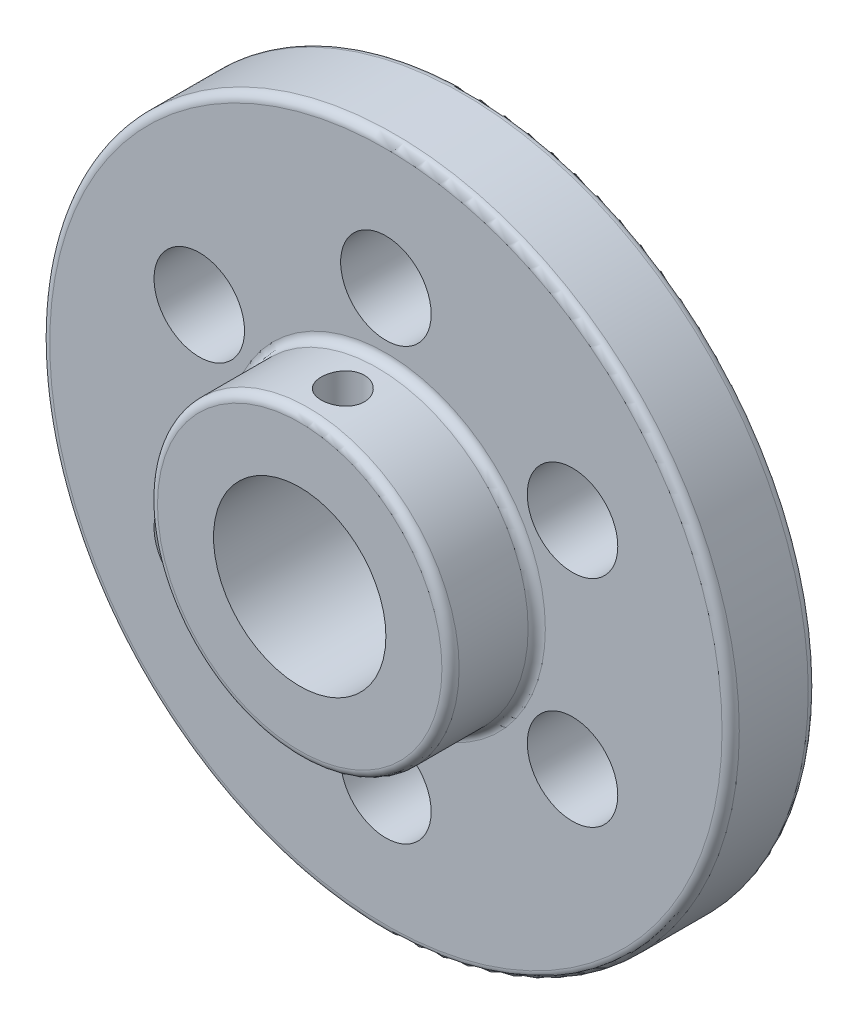
ISO-10303-21;
HEADER;
FILE_DESCRIPTION(('STEP AP214'),'2;1');
FILE_NAME('part.step','',(''),(''),'','','');
FILE_SCHEMA(('AUTOMOTIVE_DESIGN { 1 0 10303 214 1 1 1 1 }'));
ENDSEC;
DATA;
#1=APPLICATION_CONTEXT('core data for automotive mechanical design processes');
#2=APPLICATION_PROTOCOL_DEFINITION('international standard','automotive_design',2000,#1);
#3=PRODUCT_CONTEXT('',#1,'mechanical');
#4=PRODUCT('Part','Part','',(#3));
#5=PRODUCT_RELATED_PRODUCT_CATEGORY('part','',(#4));
#6=PRODUCT_DEFINITION_FORMATION('','',#4);
#7=PRODUCT_DEFINITION_CONTEXT('part definition',#1,'design');
#8=PRODUCT_DEFINITION('design','',#6,#7);
#9=PRODUCT_DEFINITION_SHAPE('','',#8);
#10=(LENGTH_UNIT() NAMED_UNIT(*) SI_UNIT(.MILLI.,.METRE.));
#11=(NAMED_UNIT(*) PLANE_ANGLE_UNIT() SI_UNIT($,.RADIAN.));
#12=(NAMED_UNIT(*) SI_UNIT($,.STERADIAN.) SOLID_ANGLE_UNIT());
#13=UNCERTAINTY_MEASURE_WITH_UNIT(LENGTH_MEASURE(1.E-05),#10,'distance_accuracy_value','');
#14=(GEOMETRIC_REPRESENTATION_CONTEXT(3) GLOBAL_UNCERTAINTY_ASSIGNED_CONTEXT((#13)) GLOBAL_UNIT_ASSIGNED_CONTEXT((#10,
#11,#12)) REPRESENTATION_CONTEXT('',''));
#15=CARTESIAN_POINT('',(0.,0.,0.));
#16=DIRECTION('',(0.,0.,1.));
#17=DIRECTION('',(1.,0.,0.));
#18=AXIS2_PLACEMENT_3D('',#15,#16,#17);
#19=CARTESIAN_POINT('',(0.,0.,10.));
#20=DIRECTION('',(0.,0.,1.));
#21=DIRECTION('',(1.,0.,0.));
#22=AXIS2_PLACEMENT_3D('',#19,#20,#21);
#23=PLANE('',#22);
#24=CARTESIAN_POINT('',(0.,0.,10.));
#25=DIRECTION('',(0.,0.,1.));
#26=DIRECTION('',(1.,0.,0.));
#27=AXIS2_PLACEMENT_3D('',#24,#25,#26);
#28=CIRCLE('',#27,18.5);
#29=CARTESIAN_POINT('',(18.5,0.,10.));
#30=VERTEX_POINT('',#29);
#31=EDGE_CURVE('E56',#30,#30,#28,.F.);
#32=ORIENTED_EDGE('',*,*,#31,.T.);
#33=EDGE_LOOP('',(#32));
#34=FACE_BOUND('',#33,.T.);
#35=CARTESIAN_POINT('',(0.,0.,10.));
#36=DIRECTION('',(0.,0.,1.));
#37=DIRECTION('',(1.,0.,0.));
#38=AXIS2_PLACEMENT_3D('',#35,#36,#37);
#39=CIRCLE('',#38,39.);
#40=CARTESIAN_POINT('',(39.,0.,10.));
#41=VERTEX_POINT('',#40);
#42=EDGE_CURVE('E61',#41,#41,#39,.T.);
#43=ORIENTED_EDGE('',*,*,#42,.T.);
#44=EDGE_LOOP('',(#43));
#45=FACE_BOUND('',#44,.T.);
#46=CARTESIAN_POINT('',(21.6506350946108,12.5000000000003,10.));
#47=DIRECTION('',(0.,0.,1.));
#48=DIRECTION('',(1.,0.,0.));
#49=AXIS2_PLACEMENT_3D('',#46,#47,#48);
#50=CIRCLE('',#49,5.24999999999999);
#51=CARTESIAN_POINT('',(26.9006350946108,12.5000000000003,10.));
#52=VERTEX_POINT('',#51);
#53=EDGE_CURVE('E109',#52,#52,#50,.T.);
#54=ORIENTED_EDGE('',*,*,#53,.F.);
#55=EDGE_LOOP('',(#54));
#56=FACE_BOUND('',#55,.T.);
#57=CARTESIAN_POINT('',(21.6506350946111,-12.4999999999998,10.));
#58=DIRECTION('',(0.,0.,1.));
#59=DIRECTION('',(1.,0.,0.));
#60=AXIS2_PLACEMENT_3D('',#57,#58,#59);
#61=CIRCLE('',#60,5.24999999999999);
#62=CARTESIAN_POINT('',(26.9006350946111,-12.4999999999998,10.));
#63=VERTEX_POINT('',#62);
#64=EDGE_CURVE('E103',#63,#63,#61,.T.);
#65=ORIENTED_EDGE('',*,*,#64,.F.);
#66=EDGE_LOOP('',(#65));
#67=FACE_BOUND('',#66,.T.);
#68=CARTESIAN_POINT('',(0.,-25.,10.));
#69=DIRECTION('',(0.,0.,1.));
#70=DIRECTION('',(1.,0.,0.));
#71=AXIS2_PLACEMENT_3D('',#68,#69,#70);
#72=CIRCLE('',#71,5.24999999999999);
#73=CARTESIAN_POINT('',(5.24999999999999,-25.,10.));
#74=VERTEX_POINT('',#73);
#75=EDGE_CURVE('E97',#74,#74,#72,.T.);
#76=ORIENTED_EDGE('',*,*,#75,.F.);
#77=EDGE_LOOP('',(#76));
#78=FACE_BOUND('',#77,.T.);
#79=CARTESIAN_POINT('',(-21.6506350946109,-12.5000000000001,10.));
#80=DIRECTION('',(0.,0.,1.));
#81=DIRECTION('',(1.,0.,0.));
#82=AXIS2_PLACEMENT_3D('',#79,#80,#81);
#83=CIRCLE('',#82,5.24999999999999);
#84=CARTESIAN_POINT('',(-16.4006350946109,-12.5000000000001,10.));
#85=VERTEX_POINT('',#84);
#86=EDGE_CURVE('E91',#85,#85,#83,.T.);
#87=ORIENTED_EDGE('',*,*,#86,.F.);
#88=EDGE_LOOP('',(#87));
#89=FACE_BOUND('',#88,.T.);
#90=CARTESIAN_POINT('',(-21.650635094611,12.5,10.));
#91=DIRECTION('',(0.,0.,1.));
#92=DIRECTION('',(1.,0.,0.));
#93=AXIS2_PLACEMENT_3D('',#90,#91,#92);
#94=CIRCLE('',#93,5.24999999999999);
#95=CARTESIAN_POINT('',(-16.400635094611,12.5,10.));
#96=VERTEX_POINT('',#95);
#97=EDGE_CURVE('E85',#96,#96,#94,.T.);
#98=ORIENTED_EDGE('',*,*,#97,.F.);
#99=EDGE_LOOP('',(#98));
#100=FACE_BOUND('',#99,.T.);
#101=CARTESIAN_POINT('',(0.,25.,10.));
#102=DIRECTION('',(0.,0.,1.));
#103=DIRECTION('',(1.,0.,0.));
#104=AXIS2_PLACEMENT_3D('',#101,#102,#103);
#105=CIRCLE('',#104,5.24999999999999);
#106=CARTESIAN_POINT('',(5.24999999999999,25.,10.));
#107=VERTEX_POINT('',#106);
#108=EDGE_CURVE('E79',#107,#107,#105,.T.);
#109=ORIENTED_EDGE('',*,*,#108,.F.);
#110=EDGE_LOOP('',(#109));
#111=FACE_BOUND('',#110,.T.);
#112=ADVANCED_FACE('F41',(#34,#45,#56,#67,#78,#89,#100,#111),#23,.T.);
#113=CARTESIAN_POINT('',(0.,0.,0.));
#114=DIRECTION('',(0.,0.,1.));
#115=DIRECTION('',(1.,0.,0.));
#116=AXIS2_PLACEMENT_3D('',#113,#114,#115);
#117=PLANE('',#116);
#118=CARTESIAN_POINT('',(0.,0.,0.));
#119=DIRECTION('',(0.,0.,1.));
#120=DIRECTION('',(1.,0.,0.));
#121=AXIS2_PLACEMENT_3D('',#118,#119,#120);
#122=CIRCLE('',#121,39.);
#123=CARTESIAN_POINT('',(39.,0.,0.));
#124=VERTEX_POINT('',#123);
#125=EDGE_CURVE('E10',#124,#124,#122,.F.);
#126=ORIENTED_EDGE('',*,*,#125,.T.);
#127=EDGE_LOOP('',(#126));
#128=FACE_BOUND('',#127,.T.);
#129=CARTESIAN_POINT('',(21.6506350946108,12.5000000000003,0.));
#130=DIRECTION('',(0.,0.,1.));
#131=DIRECTION('',(1.,0.,0.));
#132=AXIS2_PLACEMENT_3D('',#129,#130,#131);
#133=CIRCLE('',#132,5.25);
#134=CARTESIAN_POINT('',(26.9006350946108,12.5000000000003,0.));
#135=VERTEX_POINT('',#134);
#136=EDGE_CURVE('E106',#135,#135,#133,.T.);
#137=ORIENTED_EDGE('',*,*,#136,.T.);
#138=EDGE_LOOP('',(#137));
#139=FACE_BOUND('',#138,.T.);
#140=CARTESIAN_POINT('',(21.6506350946111,-12.4999999999998,0.));
#141=DIRECTION('',(0.,0.,1.));
#142=DIRECTION('',(1.,0.,0.));
#143=AXIS2_PLACEMENT_3D('',#140,#141,#142);
#144=CIRCLE('',#143,5.25);
#145=CARTESIAN_POINT('',(26.9006350946111,-12.4999999999998,0.));
#146=VERTEX_POINT('',#145);
#147=EDGE_CURVE('E100',#146,#146,#144,.T.);
#148=ORIENTED_EDGE('',*,*,#147,.T.);
#149=EDGE_LOOP('',(#148));
#150=FACE_BOUND('',#149,.T.);
#151=CARTESIAN_POINT('',(0.,-25.,0.));
#152=DIRECTION('',(0.,0.,1.));
#153=DIRECTION('',(1.,0.,0.));
#154=AXIS2_PLACEMENT_3D('',#151,#152,#153);
#155=CIRCLE('',#154,5.25);
#156=CARTESIAN_POINT('',(5.25,-25.,0.));
#157=VERTEX_POINT('',#156);
#158=EDGE_CURVE('E94',#157,#157,#155,.T.);
#159=ORIENTED_EDGE('',*,*,#158,.T.);
#160=EDGE_LOOP('',(#159));
#161=FACE_BOUND('',#160,.T.);
#162=CARTESIAN_POINT('',(-21.6506350946109,-12.5000000000001,0.));
#163=DIRECTION('',(0.,0.,1.));
#164=DIRECTION('',(1.,0.,0.));
#165=AXIS2_PLACEMENT_3D('',#162,#163,#164);
#166=CIRCLE('',#165,5.24999999999999);
#167=CARTESIAN_POINT('',(-16.4006350946109,-12.5000000000001,0.));
#168=VERTEX_POINT('',#167);
#169=EDGE_CURVE('E88',#168,#168,#166,.T.);
#170=ORIENTED_EDGE('',*,*,#169,.T.);
#171=EDGE_LOOP('',(#170));
#172=FACE_BOUND('',#171,.T.);
#173=CARTESIAN_POINT('',(-21.650635094611,12.5,0.));
#174=DIRECTION('',(0.,0.,1.));
#175=DIRECTION('',(1.,0.,0.));
#176=AXIS2_PLACEMENT_3D('',#173,#174,#175);
#177=CIRCLE('',#176,5.24999999999999);
#178=CARTESIAN_POINT('',(-16.400635094611,12.5,0.));
#179=VERTEX_POINT('',#178);
#180=EDGE_CURVE('E82',#179,#179,#177,.T.);
#181=ORIENTED_EDGE('',*,*,#180,.T.);
#182=EDGE_LOOP('',(#181));
#183=FACE_BOUND('',#182,.T.);
#184=CARTESIAN_POINT('',(0.,25.,0.));
#185=DIRECTION('',(0.,0.,1.));
#186=DIRECTION('',(1.,0.,0.));
#187=AXIS2_PLACEMENT_3D('',#184,#185,#186);
#188=CIRCLE('',#187,5.25);
#189=CARTESIAN_POINT('',(5.25,25.,0.));
#190=VERTEX_POINT('',#189);
#191=EDGE_CURVE('E76',#190,#190,#188,.T.);
#192=ORIENTED_EDGE('',*,*,#191,.T.);
#193=EDGE_LOOP('',(#192));
#194=FACE_BOUND('',#193,.T.);
#195=CARTESIAN_POINT('',(0.,0.,0.));
#196=DIRECTION('',(0.,0.,1.));
#197=DIRECTION('',(1.,0.,0.));
#198=AXIS2_PLACEMENT_3D('',#195,#196,#197);
#199=CIRCLE('',#198,10.);
#200=CARTESIAN_POINT('',(10.,0.,0.));
#201=VERTEX_POINT('',#200);
#202=EDGE_CURVE('E73',#201,#201,#199,.T.);
#203=ORIENTED_EDGE('',*,*,#202,.T.);
#204=EDGE_LOOP('',(#203));
#205=FACE_BOUND('',#204,.T.);
#206=ADVANCED_FACE('F153',(#128,#139,#150,#161,#172,#183,#194,#205),#117,.F.);
#207=CARTESIAN_POINT('',(0.,0.,10.));
#208=DIRECTION('',(0.,0.,-1.));
#209=DIRECTION('',(-1.,0.,0.));
#210=AXIS2_PLACEMENT_3D('',#207,#208,#209);
#211=CYLINDRICAL_SURFACE('',#210,40.);
#212=CARTESIAN_POINT('',(0.,0.,0.999999999999999));
#213=DIRECTION('',(0.,0.,1.));
#214=DIRECTION('',(1.,0.,0.));
#215=AXIS2_PLACEMENT_3D('',#212,#213,#214);
#216=CIRCLE('',#215,40.);
#217=CARTESIAN_POINT('',(40.,0.,0.999999999999999));
#218=VERTEX_POINT('',#217);
#219=EDGE_CURVE('E48',#218,#218,#216,.T.);
#220=ORIENTED_EDGE('',*,*,#219,.T.);
#221=EDGE_LOOP('',(#220));
#222=FACE_BOUND('',#221,.T.);
#223=CARTESIAN_POINT('',(0.,0.,9.));
#224=DIRECTION('',(0.,0.,1.));
#225=DIRECTION('',(1.,0.,0.));
#226=AXIS2_PLACEMENT_3D('',#223,#224,#225);
#227=CIRCLE('',#226,40.);
#228=CARTESIAN_POINT('',(40.,0.,9.));
#229=VERTEX_POINT('',#228);
#230=EDGE_CURVE('E52',#229,#229,#227,.F.);
#231=ORIENTED_EDGE('',*,*,#230,.T.);
#232=EDGE_LOOP('',(#231));
#233=FACE_BOUND('',#232,.T.);
#234=ADVANCED_FACE('F160',(#222,#233),#211,.T.);
#235=CARTESIAN_POINT('',(0.,0.,10.));
#236=DIRECTION('',(0.,0.,-1.));
#237=DIRECTION('',(-1.,0.,0.));
#238=AXIS2_PLACEMENT_3D('',#235,#236,#237);
#239=CYLINDRICAL_SURFACE('',#238,10.);
#240=CARTESIAN_POINT('',(0.,10.,17.5));
#241=CARTESIAN_POINT('',(-0.138126814449548,9.99999766446687,17.4999961237697));
#242=CARTESIAN_POINT('',(-0.276296929717934,9.99710963553044,17.4885140820437));
#243=CARTESIAN_POINT('',(-0.548677206284216,9.98586856383157,17.442958081155));
#244=CARTESIAN_POINT('',(-0.682885078117895,9.97751242366627,17.4088713174369));
#245=CARTESIAN_POINT('',(-0.94336812030429,9.9562604388672,17.3192679108965));
#246=CARTESIAN_POINT('',(-1.06965260571666,9.94337004736764,17.2637770021412));
#247=CARTESIAN_POINT('',(-1.31112021984071,9.91442239679369,17.1330310165919));
#248=CARTESIAN_POINT('',(-1.4263029739146,9.89836503090261,17.0577752731351));
#249=CARTESIAN_POINT('',(-1.64466987883485,9.86445689319489,16.8879986839097));
#250=CARTESIAN_POINT('',(-1.74759281676842,9.84657845246877,16.7931473750682));
#251=CARTESIAN_POINT('',(-1.93624821200553,9.81122700196561,16.5875796584849));
#252=CARTESIAN_POINT('',(-2.02197872824865,9.79375403816446,16.4768614617551));
#253=CARTESIAN_POINT('',(-2.17504423799828,9.76091292830281,16.240674622105));
#254=CARTESIAN_POINT('',(-2.24208702654189,9.74557990774685,16.1150112819854));
#255=CARTESIAN_POINT('',(-2.35399484758456,9.71915824696694,15.8537526472333));
#256=CARTESIAN_POINT('',(-2.39886342573356,9.70806892824031,15.7181589444466));
#257=CARTESIAN_POINT('',(-2.46425806134127,9.69167461160538,15.4437608363306));
#258=CARTESIAN_POINT('',(-2.48525378055341,9.68625818328352,15.30507517327));
#259=CARTESIAN_POINT('',(-2.50376962511067,9.68148937432653,15.0260523850011));
#260=CARTESIAN_POINT('',(-2.50129356969684,9.68213600713214,14.8857155321798));
#261=CARTESIAN_POINT('',(-2.4733108743995,9.68932009194695,14.6109736537577));
#262=CARTESIAN_POINT('',(-2.44836390031771,9.6957143834549,14.4765072975578));
#263=CARTESIAN_POINT('',(-2.37704031150498,9.71344516118448,14.2137315818149));
#264=CARTESIAN_POINT('',(-2.33066217011565,9.72478199948731,14.0854226616185));
#265=CARTESIAN_POINT('',(-2.21731579656197,9.75125189842765,13.8371033062465));
#266=CARTESIAN_POINT('',(-2.15014444538819,9.76642212449693,13.717189713684));
#267=CARTESIAN_POINT('',(-1.9972604600249,9.79882851409985,13.4901354837386));
#268=CARTESIAN_POINT('',(-1.91154458134805,9.81606503891047,13.3829970865546));
#269=CARTESIAN_POINT('',(-1.72110570780203,9.85126467566486,13.181327307176));
#270=CARTESIAN_POINT('',(-1.61591043027643,9.86923449130002,13.0872425165644));
#271=CARTESIAN_POINT('',(-1.39101986250616,9.90343275964594,12.9179645958935));
#272=CARTESIAN_POINT('',(-1.27132412951323,9.91966115915679,12.8427720428941));
#273=CARTESIAN_POINT('',(-1.02019314780231,9.94862886823651,12.7132490229594));
#274=CARTESIAN_POINT('',(-0.888718988681032,9.96135600212879,12.658991099576));
#275=CARTESIAN_POINT('',(-0.618126680238132,9.98179861652361,12.5734711571507));
#276=CARTESIAN_POINT('',(-0.479009998584135,9.98951505565468,12.5422047393031));
#277=CARTESIAN_POINT('',(-0.20089995065004,9.99892498785624,12.5042373907353));
#278=CARTESIAN_POINT('',(-0.0619945333136792,10.0007675584713,12.4969282898745));
#279=CARTESIAN_POINT('',(0.215054791335851,9.99864674690754,12.5054150034258));
#280=CARTESIAN_POINT('',(0.35319876607433,9.99468388736421,12.5212087379986));
#281=CARTESIAN_POINT('',(0.62269044796082,9.98149301878918,12.5749515139856));
#282=CARTESIAN_POINT('',(0.754108531614586,9.97234390309647,12.6125687724616));
#283=CARTESIAN_POINT('',(1.00876215408753,9.94981177723595,12.7085118067141));
#284=CARTESIAN_POINT('',(1.13199686505442,9.93642833949965,12.7668396738554));
#285=CARTESIAN_POINT('',(1.36920522404972,9.9065551321037,12.9037268814578));
#286=CARTESIAN_POINT('',(1.48297573639294,9.89001445610999,12.9826268539943));
#287=CARTESIAN_POINT('',(1.69587768940552,9.85574181979586,13.1579831813286));
#288=CARTESIAN_POINT('',(1.79500659828875,9.83800965421578,13.2544425660294));
#289=CARTESIAN_POINT('',(1.97831761345414,9.80281594932498,13.4650032680728));
#290=CARTESIAN_POINT('',(2.06207311270184,9.78537173637463,13.5794795049993));
#291=CARTESIAN_POINT('',(2.20918459835604,9.75321463970069,13.8212210574476));
#292=CARTESIAN_POINT('',(2.27254149026901,9.73850163474941,13.9484858049507));
#293=CARTESIAN_POINT('',(2.37658570101223,9.71363491194665,14.2115095373437));
#294=CARTESIAN_POINT('',(2.41740732773931,9.70345425375809,14.3472127138538));
#295=CARTESIAN_POINT('',(2.47557609990489,9.68877906706586,14.6238493964255));
#296=CARTESIAN_POINT('',(2.49292837912652,9.68428329504044,14.7647817517024));
#297=CARTESIAN_POINT('',(2.50339765056083,9.68158168701612,15.0435350397693));
#298=CARTESIAN_POINT('',(2.49719649630131,9.68319887888034,15.1813290585441));
#299=CARTESIAN_POINT('',(2.46229546385366,9.69213181672143,15.4538398144438));
#300=CARTESIAN_POINT('',(2.43359603781098,9.69944744817731,15.5885566133553));
#301=CARTESIAN_POINT('',(2.35488553240495,9.71885434473222,15.8503474317764));
#302=CARTESIAN_POINT('',(2.30500234113404,9.73091692061057,15.9774621754006));
#303=CARTESIAN_POINT('',(2.18544152267504,9.7584625954084,16.2216089711893));
#304=CARTESIAN_POINT('',(2.11576115005696,9.77394616867808,16.3386396219781));
#305=CARTESIAN_POINT('',(1.95644624772858,9.80709390439337,16.5625910483368));
#306=CARTESIAN_POINT('',(1.86633860485376,9.82480441386302,16.6691684557066));
#307=CARTESIAN_POINT('',(1.66964895198289,9.86013378743769,16.8659117413257));
#308=CARTESIAN_POINT('',(1.56306303543524,9.87775262878422,16.9560737168549));
#309=CARTESIAN_POINT('',(1.33411264450432,9.9112942607945,17.1190188476077));
#310=CARTESIAN_POINT('',(1.21149737052731,9.92718055609783,17.1914576894526));
#311=CARTESIAN_POINT('',(0.95544343251746,9.95508208291861,17.3145791049009));
#312=CARTESIAN_POINT('',(0.8220126057279,9.96710008666301,17.3652772677476));
#313=CARTESIAN_POINT('',(0.574017088739121,9.98413432609236,17.4359530505494));
#314=CARTESIAN_POINT('',(0.460633618180116,9.99004308421151,17.4599187384224));
#315=CARTESIAN_POINT('',(0.231510119227141,9.9979767538658,17.4919432393699));
#316=CARTESIAN_POINT('',(0.115770268737697,10.0000019575149,17.5000032488422));
#317=CARTESIAN_POINT('',(0.,10.,17.5));
#318=B_SPLINE_CURVE_WITH_KNOTS('',3,(#240,#241,#242,#243,#244,#245,#246,#247,#248,#249,#250,
#251,#252,#253,#254,#255,#256,#257,#258,#259,#260,#261,#262,#263,#264,#265,#266,#267,#268,#269,
#270,#271,#272,#273,#274,#275,#276,#277,#278,#279,#280,#281,#282,#283,#284,#285,#286,#287,#288,
#289,#290,#291,#292,#293,#294,#295,#296,#297,#298,#299,#300,#301,#302,#303,#304,#305,#306,#307,
#308,#309,#310,#311,#312,#313,#314,#315,#316,#317),.UNSPECIFIED.,.T.,.F.,(4,2,2,2,2,2,2,2,2,2,2,
2,2,2,2,2,2,2,2,2,2,2,2,2,2,2,2,2,2,2,2,2,2,2,2,2,2,2,4),(0.,0.413956187453149,
0.828147062939831,1.24184150381018,1.65554990028221,2.07690725728565,2.49831215966769,
2.92597745909678,3.3535743528228,3.77260491835116,4.19156730193362,4.6003749501723,
5.00921172448931,5.42217546461999,5.83521151399138,6.26002501620566,6.68485149269278,
7.11113715020723,7.53734122819938,7.95263848254327,8.36789835193437,8.77700457528928,
9.1861521220935,9.60255979281119,10.0190393835223,10.4457418201299,10.8724253125471,
11.2965375769763,11.7205570543047,12.1323963400748,12.5442273493652,12.9536066760887,
13.3630428023796,13.7831596069298,14.2033761629382,14.6312030917577,15.0587227304538,
15.4057040491338,15.7526592674819),.UNSPECIFIED.);
#319=CARTESIAN_POINT('',(0.,10.,17.5));
#320=VERTEX_POINT('',#319);
#321=EDGE_CURVE('E123',#320,#320,#318,.T.);
#322=ORIENTED_EDGE('',*,*,#321,.F.);
#323=EDGE_LOOP('',(#322));
#324=FACE_BOUND('',#323,.T.);
#325=ORIENTED_EDGE('',*,*,#202,.F.);
#326=EDGE_LOOP('',(#325));
#327=FACE_BOUND('',#326,.T.);
#328=CARTESIAN_POINT('',(0.,0.,20.));
#329=DIRECTION('',(0.,0.,1.));
#330=DIRECTION('',(1.,0.,0.));
#331=AXIS2_PLACEMENT_3D('',#328,#329,#330);
#332=CIRCLE('',#331,10.);
#333=CARTESIAN_POINT('',(10.,0.,20.));
#334=VERTEX_POINT('',#333);
#335=EDGE_CURVE('E112',#334,#334,#332,.T.);
#336=ORIENTED_EDGE('',*,*,#335,.T.);
#337=EDGE_LOOP('',(#336));
#338=FACE_BOUND('',#337,.T.);
#339=ADVANCED_FACE('F164',(#324,#327,#338),#239,.F.);
#340=CARTESIAN_POINT('',(0.,25.,10.));
#341=DIRECTION('',(0.,0.,1.));
#342=DIRECTION('',(1.,0.,0.));
#343=AXIS2_PLACEMENT_3D('',#340,#341,#342);
#344=CYLINDRICAL_SURFACE('',#343,5.24999999999999);
#345=ORIENTED_EDGE('',*,*,#191,.F.);
#346=EDGE_LOOP('',(#345));
#347=FACE_BOUND('',#346,.T.);
#348=ORIENTED_EDGE('',*,*,#108,.T.);
#349=EDGE_LOOP('',(#348));
#350=FACE_BOUND('',#349,.T.);
#351=ADVANCED_FACE('F200',(#347,#350),#344,.F.);
#352=CARTESIAN_POINT('',(-21.650635094611,12.5,10.));
#353=DIRECTION('',(0.,0.,1.));
#354=DIRECTION('',(1.,0.,0.));
#355=AXIS2_PLACEMENT_3D('',#352,#353,#354);
#356=CYLINDRICAL_SURFACE('',#355,5.24999999999999);
#357=ORIENTED_EDGE('',*,*,#180,.F.);
#358=EDGE_LOOP('',(#357));
#359=FACE_BOUND('',#358,.T.);
#360=ORIENTED_EDGE('',*,*,#97,.T.);
#361=EDGE_LOOP('',(#360));
#362=FACE_BOUND('',#361,.T.);
#363=ADVANCED_FACE('F202',(#359,#362),#356,.F.);
#364=CARTESIAN_POINT('',(-21.6506350946109,-12.5000000000001,10.));
#365=DIRECTION('',(0.,0.,1.));
#366=DIRECTION('',(1.,0.,0.));
#367=AXIS2_PLACEMENT_3D('',#364,#365,#366);
#368=CYLINDRICAL_SURFACE('',#367,5.24999999999999);
#369=ORIENTED_EDGE('',*,*,#169,.F.);
#370=EDGE_LOOP('',(#369));
#371=FACE_BOUND('',#370,.T.);
#372=ORIENTED_EDGE('',*,*,#86,.T.);
#373=EDGE_LOOP('',(#372));
#374=FACE_BOUND('',#373,.T.);
#375=ADVANCED_FACE('F208',(#371,#374),#368,.F.);
#376=CARTESIAN_POINT('',(0.,-25.,10.));
#377=DIRECTION('',(0.,0.,1.));
#378=DIRECTION('',(1.,0.,0.));
#379=AXIS2_PLACEMENT_3D('',#376,#377,#378);
#380=CYLINDRICAL_SURFACE('',#379,5.24999999999999);
#381=ORIENTED_EDGE('',*,*,#158,.F.);
#382=EDGE_LOOP('',(#381));
#383=FACE_BOUND('',#382,.T.);
#384=ORIENTED_EDGE('',*,*,#75,.T.);
#385=EDGE_LOOP('',(#384));
#386=FACE_BOUND('',#385,.T.);
#387=ADVANCED_FACE('F217',(#383,#386),#380,.F.);
#388=CARTESIAN_POINT('',(21.6506350946111,-12.4999999999998,10.));
#389=DIRECTION('',(0.,0.,1.));
#390=DIRECTION('',(1.,0.,0.));
#391=AXIS2_PLACEMENT_3D('',#388,#389,#390);
#392=CYLINDRICAL_SURFACE('',#391,5.24999999999999);
#393=ORIENTED_EDGE('',*,*,#147,.F.);
#394=EDGE_LOOP('',(#393));
#395=FACE_BOUND('',#394,.T.);
#396=ORIENTED_EDGE('',*,*,#64,.T.);
#397=EDGE_LOOP('',(#396));
#398=FACE_BOUND('',#397,.T.);
#399=ADVANCED_FACE('F149',(#395,#398),#392,.F.);
#400=CARTESIAN_POINT('',(21.6506350946108,12.5000000000003,10.));
#401=DIRECTION('',(0.,0.,1.));
#402=DIRECTION('',(1.,0.,0.));
#403=AXIS2_PLACEMENT_3D('',#400,#401,#402);
#404=CYLINDRICAL_SURFACE('',#403,5.24999999999999);
#405=ORIENTED_EDGE('',*,*,#136,.F.);
#406=EDGE_LOOP('',(#405));
#407=FACE_BOUND('',#406,.T.);
#408=ORIENTED_EDGE('',*,*,#53,.T.);
#409=EDGE_LOOP('',(#408));
#410=FACE_BOUND('',#409,.T.);
#411=ADVANCED_FACE('F141',(#407,#410),#404,.F.);
#412=CARTESIAN_POINT('',(0.,0.,20.));
#413=DIRECTION('',(0.,0.,1.));
#414=DIRECTION('',(1.,0.,0.));
#415=AXIS2_PLACEMENT_3D('',#412,#413,#414);
#416=PLANE('',#415);
#417=CARTESIAN_POINT('',(0.,0.,20.));
#418=DIRECTION('',(0.,0.,1.));
#419=DIRECTION('',(1.,0.,0.));
#420=AXIS2_PLACEMENT_3D('',#417,#418,#419);
#421=CIRCLE('',#420,16.5);
#422=CARTESIAN_POINT('',(16.5,0.,20.));
#423=VERTEX_POINT('',#422);
#424=EDGE_CURVE('E70',#423,#423,#421,.T.);
#425=ORIENTED_EDGE('',*,*,#424,.T.);
#426=EDGE_LOOP('',(#425));
#427=FACE_BOUND('',#426,.T.);
#428=ORIENTED_EDGE('',*,*,#335,.F.);
#429=EDGE_LOOP('',(#428));
#430=FACE_BOUND('',#429,.T.);
#431=ADVANCED_FACE('F139',(#427,#430),#416,.T.);
#432=CARTESIAN_POINT('',(0.,0.,20.));
#433=DIRECTION('',(0.,0.,-1.));
#434=DIRECTION('',(-1.,0.,0.));
#435=AXIS2_PLACEMENT_3D('',#432,#433,#434);
#436=CYLINDRICAL_SURFACE('',#435,17.5);
#437=CARTESIAN_POINT('',(0.,0.,19.));
#438=DIRECTION('',(0.,0.,1.));
#439=DIRECTION('',(1.,0.,0.));
#440=AXIS2_PLACEMENT_3D('',#437,#438,#439);
#441=CIRCLE('',#440,17.5);
#442=CARTESIAN_POINT('',(17.5,0.,19.));
#443=VERTEX_POINT('',#442);
#444=EDGE_CURVE('E64',#443,#443,#441,.F.);
#445=ORIENTED_EDGE('',*,*,#444,.T.);
#446=EDGE_LOOP('',(#445));
#447=FACE_BOUND('',#446,.T.);
#448=CARTESIAN_POINT('',(0.,0.,11.));
#449=DIRECTION('',(0.,0.,1.));
#450=DIRECTION('',(1.,0.,0.));
#451=AXIS2_PLACEMENT_3D('',#448,#449,#450);
#452=CIRCLE('',#451,17.5);
#453=CARTESIAN_POINT('',(17.5,0.,11.));
#454=VERTEX_POINT('',#453);
#455=EDGE_CURVE('E67',#454,#454,#452,.T.);
#456=ORIENTED_EDGE('',*,*,#455,.T.);
#457=EDGE_LOOP('',(#456));
#458=FACE_BOUND('',#457,.T.);
#459=CARTESIAN_POINT('',(0.,17.5,17.5));
#460=CARTESIAN_POINT('',(-0.139663411766026,17.4999978380721,17.499994183528));
#461=CARTESIAN_POINT('',(-0.279409763738791,17.4983105050074,17.4882569821015));
#462=CARTESIAN_POINT('',(-0.5550016509202,17.4917417626469,17.441627159415));
#463=CARTESIAN_POINT('',(-0.690843163833694,17.4868571749077,17.406711495574));
#464=CARTESIAN_POINT('',(-0.954596691963603,17.4744432540456,17.3147848456644));
#465=CARTESIAN_POINT('',(-1.08251442337442,17.4669158542074,17.2577900079337));
#466=CARTESIAN_POINT('',(-1.32694912560079,17.4500497270147,17.1233611427616));
#467=CARTESIAN_POINT('',(-1.44346778859662,17.4407112691256,17.045930155376));
#468=CARTESIAN_POINT('',(-1.66264662599328,17.4211884780223,16.8722395720818));
#469=CARTESIAN_POINT('',(-1.76521397700162,17.4109991441869,16.7758633928552));
#470=CARTESIAN_POINT('',(-1.95277822942156,17.3909624955304,16.5672689636509));
#471=CARTESIAN_POINT('',(-2.03777415677173,17.3811151996951,16.4550498360087));
#472=CARTESIAN_POINT('',(-2.18813969105556,17.3628289122671,16.2173372098656));
#473=CARTESIAN_POINT('',(-2.2534203136847,17.3543963799907,16.0917868842871));
#474=CARTESIAN_POINT('',(-2.36193362917024,17.3399620664072,15.8313636512724));
#475=CARTESIAN_POINT('',(-2.40516741136245,17.3339601650054,15.6964912048167));
#476=CARTESIAN_POINT('',(-2.46807330015291,17.3251154844148,15.42222497543));
#477=CARTESIAN_POINT('',(-2.48790372131988,17.3222514880901,15.2828682001804));
#478=CARTESIAN_POINT('',(-2.5039302501892,17.3199423461355,15.002777736413));
#479=CARTESIAN_POINT('',(-2.50012759067447,17.320497022176,14.8620441200982));
#480=CARTESIAN_POINT('',(-2.46912545244851,17.3249431442757,14.5843086366673));
#481=CARTESIAN_POINT('',(-2.44210170449122,17.328809527553,14.4472866948854));
#482=CARTESIAN_POINT('',(-2.36569930803571,17.3394042922377,14.1797422842893));
#483=CARTESIAN_POINT('',(-2.31632008118702,17.3461327476885,14.0492199837221));
#484=CARTESIAN_POINT('',(-2.19642380312383,17.361721443382,13.7978418172289));
#485=CARTESIAN_POINT('',(-2.12583173279084,17.3705892270314,13.6770222190355));
#486=CARTESIAN_POINT('',(-1.96556711430094,17.3894518472516,13.4488769695267));
#487=CARTESIAN_POINT('',(-1.87589342878137,17.3994467509879,13.3415521231751));
#488=CARTESIAN_POINT('',(-1.67904364678596,17.4195483920113,13.1424239922134));
#489=CARTESIAN_POINT('',(-1.57171634394401,17.4296553221133,13.0507701373501));
#490=CARTESIAN_POINT('',(-1.34312289850221,17.4487579473899,12.8867537469418));
#491=CARTESIAN_POINT('',(-1.22185670468122,17.4577536384806,12.8143912822901));
#492=CARTESIAN_POINT('',(-0.968702599534602,17.4736283828367,12.6910064062518));
#493=CARTESIAN_POINT('',(-0.836809319334129,17.4805063576505,12.6399948631322));
#494=CARTESIAN_POINT('',(-0.566208373442736,17.4913614986505,12.5608863267006));
#495=CARTESIAN_POINT('',(-0.427501125789095,17.4953388425539,12.5327879295227));
#496=CARTESIAN_POINT('',(-0.148500027987424,17.4999211821592,12.5005004664745));
#497=CARTESIAN_POINT('',(-0.0082304244279815,17.500555170306,12.4961058419144));
#498=CARTESIAN_POINT('',(0.271043562891625,17.4984580908463,12.5108060100251));
#499=CARTESIAN_POINT('',(0.410047981970078,17.4957271174665,12.5299001449564));
#500=CARTESIAN_POINT('',(0.682228022480614,17.4872249216538,12.5908649269934));
#501=CARTESIAN_POINT('',(0.815426381150157,17.4814669841261,12.6326360739745));
#502=CARTESIAN_POINT('',(1.07292868003086,17.4675546784054,12.7376646741193));
#503=CARTESIAN_POINT('',(1.19723223635135,17.4594002068579,12.8009230539739));
#504=CARTESIAN_POINT('',(1.43432461974733,17.4415297146367,12.9476172712343));
#505=CARTESIAN_POINT('',(1.54703151587247,17.4318036856151,13.0311842871318));
#506=CARTESIAN_POINT('',(1.75689411850608,17.4119055803847,13.2159400950653));
#507=CARTESIAN_POINT('',(1.85404900884823,17.4017334808018,13.3171298113558));
#508=CARTESIAN_POINT('',(2.03079205775959,17.3819985021213,13.5351708762056));
#509=CARTESIAN_POINT('',(2.11024287606047,17.3724407693564,13.6521340878757));
#510=CARTESIAN_POINT('',(2.24836960942393,17.3551058935101,13.897866483255));
#511=CARTESIAN_POINT('',(2.30704604381354,17.3473287059197,14.0266353717395));
#512=CARTESIAN_POINT('',(2.40174263448166,17.334472128272,14.2919041306329));
#513=CARTESIAN_POINT('',(2.43783662664963,17.3293839547404,14.4283771985516));
#514=CARTESIAN_POINT('',(2.48657966500191,17.3224576158054,14.7055257013195));
#515=CARTESIAN_POINT('',(2.49923016741274,17.3206192485359,14.8462008745971));
#516=CARTESIAN_POINT('',(2.50069487967763,17.3204077218135,15.1263922831516));
#517=CARTESIAN_POINT('',(2.48972496709757,17.3220031790397,15.2659074145691));
#518=CARTESIAN_POINT('',(2.44472119813499,17.3284115526498,15.5410876550731));
#519=CARTESIAN_POINT('',(2.41068736551688,17.3332244657184,15.6767527681263));
#520=CARTESIAN_POINT('',(2.32059556957245,17.3455148684689,15.940331581389));
#521=CARTESIAN_POINT('',(2.26455128703251,17.3529907027211,16.0682500397038));
#522=CARTESIAN_POINT('',(2.13205080253859,17.3697668215923,16.3129030561918));
#523=CARTESIAN_POINT('',(2.05559403989799,17.3790671563245,16.4296373070392));
#524=CARTESIAN_POINT('',(1.88364934328869,17.3985457831611,16.6497072731611));
#525=CARTESIAN_POINT('',(1.78800116175456,17.4087310282957,16.7529171815028));
#526=CARTESIAN_POINT('',(1.58072689165144,17.4287727756758,16.9418996342903));
#527=CARTESIAN_POINT('',(1.46909708041868,17.4386292006667,17.0276681047356));
#528=CARTESIAN_POINT('',(1.23237928066731,17.456958281157,17.1797094650452));
#529=CARTESIAN_POINT('',(1.10722714681787,17.4654238139941,17.2458833176974));
#530=CARTESIAN_POINT('',(0.847526610462544,17.4799469509361,17.3561746800076));
#531=CARTESIAN_POINT('',(0.712988256498725,17.4860070850385,17.4003153767905));
#532=CARTESIAN_POINT('',(0.481514204996946,17.4936295375631,17.4551044836408));
#533=CARTESIAN_POINT('',(0.386017373973216,17.4960063857058,17.4719150461728));
#534=CARTESIAN_POINT('',(0.193693651707078,17.4991923582224,17.4943647613602));
#535=CARTESIAN_POINT('',(0.0968667747788269,17.5000014994549,17.5000040341481));
#536=CARTESIAN_POINT('',(0.,17.5,17.5));
#537=B_SPLINE_CURVE_WITH_KNOTS('',3,(#459,#460,#461,#462,#463,#464,#465,#466,#467,#468,#469,
#470,#471,#472,#473,#474,#475,#476,#477,#478,#479,#480,#481,#482,#483,#484,#485,#486,#487,#488,
#489,#490,#491,#492,#493,#494,#495,#496,#497,#498,#499,#500,#501,#502,#503,#504,#505,#506,#507,
#508,#509,#510,#511,#512,#513,#514,#515,#516,#517,#518,#519,#520,#521,#522,#523,#524,#525,#526,
#527,#528,#529,#530,#531,#532,#533,#534,#535,#536),.UNSPECIFIED.,.T.,.F.,(4,2,2,2,2,2,2,2,2,2,2,
2,2,2,2,2,2,2,2,2,2,2,2,2,2,2,2,2,2,2,2,2,2,2,2,2,2,2,4),(0.,0.418636316691095,
0.837689439989587,1.25643665174213,1.67512160626292,2.09646858572017,2.51783891603734,
2.94108360106393,3.36430737151645,3.78465148302442,4.20497366811947,4.6221427072465,
5.03932253941862,5.45799544527373,5.8766933131866,6.29918445883369,6.72167715705574,
7.14438465609576,7.56706625431559,7.98607640107604,8.40507481485073,8.82224947171173,
9.23944212256236,9.65940469983285,10.0793893094395,10.5025265590586,10.9256532301628,
11.3473891092606,11.7690987907419,12.186970648089,12.6048420748735,13.0224541800635,
13.4400777573338,13.8613455938684,14.2827117181139,14.7061725624914,15.1291868230766,
15.419544801447,15.7098996573851),.UNSPECIFIED.);
#538=CARTESIAN_POINT('',(0.,17.5,17.5));
#539=VERTEX_POINT('',#538);
#540=EDGE_CURVE('E115',#539,#539,#537,.T.);
#541=ORIENTED_EDGE('',*,*,#540,.T.);
#542=EDGE_LOOP('',(#541));
#543=FACE_BOUND('',#542,.T.);
#544=ADVANCED_FACE('F128',(#447,#458,#543),#436,.T.);
#545=CARTESIAN_POINT('',(0.,17.5,15.));
#546=DIRECTION('',(0.,1.,0.));
#547=DIRECTION('',(0.,0.,1.));
#548=AXIS2_PLACEMENT_3D('',#545,#546,#547);
#549=CYLINDRICAL_SURFACE('',#548,2.5);
#550=ORIENTED_EDGE('',*,*,#321,.T.);
#551=EDGE_LOOP('',(#550));
#552=FACE_BOUND('',#551,.T.);
#553=ORIENTED_EDGE('',*,*,#540,.F.);
#554=EDGE_LOOP('',(#553));
#555=FACE_BOUND('',#554,.T.);
#556=ADVANCED_FACE('F132',(#552,#555),#549,.F.);
#557=CARTESIAN_POINT('',(0.,0.,19.));
#558=DIRECTION('',(0.,0.,1.));
#559=DIRECTION('',(1.,0.,0.));
#560=AXIS2_PLACEMENT_3D('',#557,#558,#559);
#561=TOROIDAL_SURFACE('',#560,16.5,1.);
#562=ORIENTED_EDGE('',*,*,#444,.F.);
#563=EDGE_LOOP('',(#562));
#564=FACE_BOUND('',#563,.T.);
#565=ORIENTED_EDGE('',*,*,#424,.F.);
#566=EDGE_LOOP('',(#565));
#567=FACE_BOUND('',#566,.T.);
#568=ADVANCED_FACE('F135',(#564,#567),#561,.T.);
#569=CARTESIAN_POINT('',(0.,0.,11.));
#570=DIRECTION('',(0.,0.,1.));
#571=DIRECTION('',(1.,0.,0.));
#572=AXIS2_PLACEMENT_3D('',#569,#570,#571);
#573=TOROIDAL_SURFACE('',#572,18.5,1.);
#574=ORIENTED_EDGE('',*,*,#31,.F.);
#575=EDGE_LOOP('',(#574));
#576=FACE_BOUND('',#575,.T.);
#577=ORIENTED_EDGE('',*,*,#455,.F.);
#578=EDGE_LOOP('',(#577));
#579=FACE_BOUND('',#578,.T.);
#580=ADVANCED_FACE('F170',(#576,#579),#573,.F.);
#581=CARTESIAN_POINT('',(0.,0.,0.999999999999999));
#582=DIRECTION('',(0.,0.,1.));
#583=DIRECTION('',(1.,0.,0.));
#584=AXIS2_PLACEMENT_3D('',#581,#582,#583);
#585=TOROIDAL_SURFACE('',#584,39.,1.);
#586=ORIENTED_EDGE('',*,*,#125,.F.);
#587=EDGE_LOOP('',(#586));
#588=FACE_BOUND('',#587,.T.);
#589=ORIENTED_EDGE('',*,*,#219,.F.);
#590=EDGE_LOOP('',(#589));
#591=FACE_BOUND('',#590,.T.);
#592=ADVANCED_FACE('F173',(#588,#591),#585,.T.);
#593=CARTESIAN_POINT('',(0.,0.,9.));
#594=DIRECTION('',(0.,0.,1.));
#595=DIRECTION('',(1.,0.,0.));
#596=AXIS2_PLACEMENT_3D('',#593,#594,#595);
#597=TOROIDAL_SURFACE('',#596,39.,1.);
#598=ORIENTED_EDGE('',*,*,#230,.F.);
#599=EDGE_LOOP('',(#598));
#600=FACE_BOUND('',#599,.T.);
#601=ORIENTED_EDGE('',*,*,#42,.F.);
#602=EDGE_LOOP('',(#601));
#603=FACE_BOUND('',#602,.T.);
#604=ADVANCED_FACE('F43',(#600,#603),#597,.T.);
#605=CLOSED_SHELL('',(#112,#206,#234,#339,#351,#363,#375,#387,#399,#411,#431,#544,#556,#568,
#580,#592,#604));
#606=MANIFOLD_SOLID_BREP('B2',#605);
#607=ADVANCED_BREP_SHAPE_REPRESENTATION('',(#18,#606),#14);
#608=SHAPE_DEFINITION_REPRESENTATION(#9,#607);
ENDSEC;
END-ISO-10303-21;
